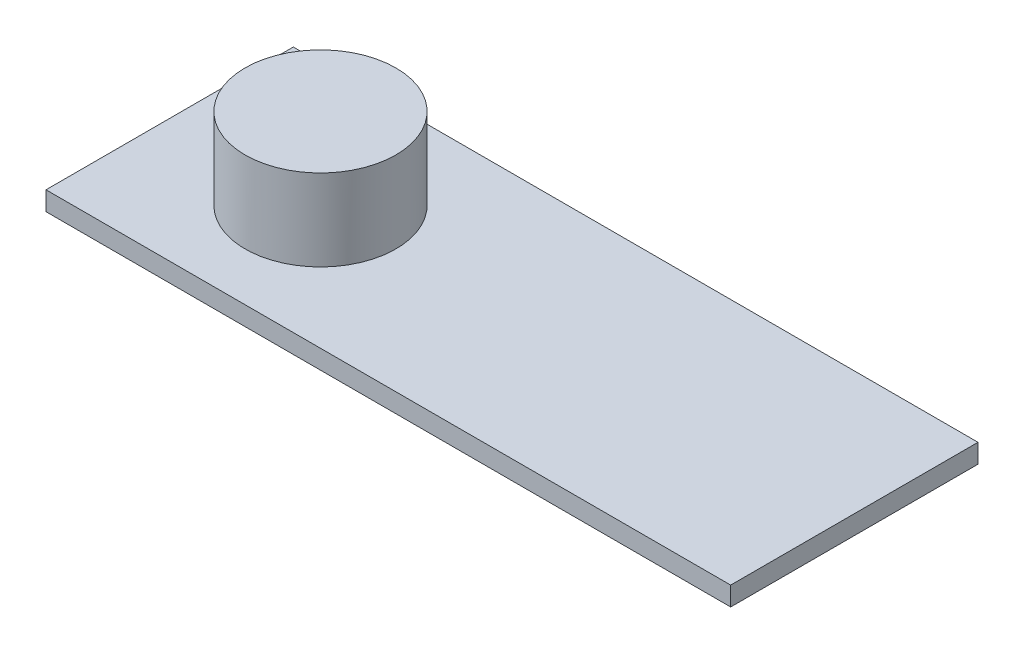
ISO-10303-21;
HEADER;
FILE_DESCRIPTION(('STEP AP214'),'2;1');
FILE_NAME('part.step','',(''),(''),'','','');
FILE_SCHEMA(('AUTOMOTIVE_DESIGN { 1 0 10303 214 1 1 1 1 }'));
ENDSEC;
DATA;
#1=APPLICATION_CONTEXT('core data for automotive mechanical design processes');
#2=APPLICATION_PROTOCOL_DEFINITION('international standard','automotive_design',2000,#1);
#3=PRODUCT_CONTEXT('',#1,'mechanical');
#4=PRODUCT('Part','Part','',(#3));
#5=PRODUCT_RELATED_PRODUCT_CATEGORY('part','',(#4));
#6=PRODUCT_DEFINITION_FORMATION('','',#4);
#7=PRODUCT_DEFINITION_CONTEXT('part definition',#1,'design');
#8=PRODUCT_DEFINITION('design','',#6,#7);
#9=PRODUCT_DEFINITION_SHAPE('','',#8);
#10=(LENGTH_UNIT() NAMED_UNIT(*) SI_UNIT(.MILLI.,.METRE.));
#11=(NAMED_UNIT(*) PLANE_ANGLE_UNIT() SI_UNIT($,.RADIAN.));
#12=(NAMED_UNIT(*) SI_UNIT($,.STERADIAN.) SOLID_ANGLE_UNIT());
#13=UNCERTAINTY_MEASURE_WITH_UNIT(LENGTH_MEASURE(1.E-05),#10,'distance_accuracy_value','');
#14=(GEOMETRIC_REPRESENTATION_CONTEXT(3) GLOBAL_UNCERTAINTY_ASSIGNED_CONTEXT((#13)) GLOBAL_UNIT_ASSIGNED_CONTEXT((#10,
#11,#12)) REPRESENTATION_CONTEXT('',''));
#15=CARTESIAN_POINT('',(0.,0.,0.));
#16=DIRECTION('',(0.,0.,1.));
#17=DIRECTION('',(1.,0.,0.));
#18=AXIS2_PLACEMENT_3D('',#15,#16,#17);
#19=CARTESIAN_POINT('',(28.829,1.6,10.414));
#20=DIRECTION('',(-1.,0.,0.));
#21=DIRECTION('',(0.,0.,1.));
#22=AXIS2_PLACEMENT_3D('',#19,#20,#21);
#23=PLANE('',#22);
#24=DIRECTION('',(0.,0.,-1.));
#25=VECTOR('',#24,1.);
#26=CARTESIAN_POINT('',(28.829,0.,10.414));
#27=LINE('',#26,#25);
#28=CARTESIAN_POINT('',(28.829,0.,10.414));
#29=VERTEX_POINT('',#28);
#30=CARTESIAN_POINT('',(28.829,0.,-10.414));
#31=VERTEX_POINT('',#30);
#32=EDGE_CURVE('E112',#29,#31,#27,.T.);
#33=ORIENTED_EDGE('',*,*,#32,.T.);
#34=DIRECTION('',(0.,-1.,0.));
#35=VECTOR('',#34,1.);
#36=CARTESIAN_POINT('',(28.829,1.6,-10.414));
#37=LINE('',#36,#35);
#38=CARTESIAN_POINT('',(28.829,1.6,-10.414));
#39=VERTEX_POINT('',#38);
#40=EDGE_CURVE('E50',#39,#31,#37,.T.);
#41=ORIENTED_EDGE('',*,*,#40,.F.);
#42=DIRECTION('',(0.,0.,-1.));
#43=VECTOR('',#42,1.);
#44=CARTESIAN_POINT('',(28.829,1.6,10.414));
#45=LINE('',#44,#43);
#46=CARTESIAN_POINT('',(28.829,1.6,10.414));
#47=VERTEX_POINT('',#46);
#48=EDGE_CURVE('E94',#47,#39,#45,.T.);
#49=ORIENTED_EDGE('',*,*,#48,.F.);
#50=DIRECTION('',(0.,-1.,0.));
#51=VECTOR('',#50,1.);
#52=CARTESIAN_POINT('',(28.829,1.6,10.414));
#53=LINE('',#52,#51);
#54=EDGE_CURVE('E108',#47,#29,#53,.T.);
#55=ORIENTED_EDGE('',*,*,#54,.T.);
#56=EDGE_LOOP('',(#33,#41,#49,#55));
#57=FACE_BOUND('',#56,.T.);
#58=ADVANCED_FACE('F41',(#57),#23,.F.);
#59=CARTESIAN_POINT('',(-28.829,1.6,-10.414));
#60=DIRECTION('',(0.,0.,1.));
#61=DIRECTION('',(1.,0.,0.));
#62=AXIS2_PLACEMENT_3D('',#59,#60,#61);
#63=PLANE('',#62);
#64=DIRECTION('',(-1.,0.,0.));
#65=VECTOR('',#64,1.);
#66=CARTESIAN_POINT('',(-28.829,0.,-10.414));
#67=LINE('',#66,#65);
#68=CARTESIAN_POINT('',(-28.829,0.,-10.414));
#69=VERTEX_POINT('',#68);
#70=EDGE_CURVE('E100',#31,#69,#67,.T.);
#71=ORIENTED_EDGE('',*,*,#70,.T.);
#72=DIRECTION('',(0.,-1.,0.));
#73=VECTOR('',#72,1.);
#74=CARTESIAN_POINT('',(-28.829,1.6,-10.414));
#75=LINE('',#74,#73);
#76=CARTESIAN_POINT('',(-28.829,1.6,-10.414));
#77=VERTEX_POINT('',#76);
#78=EDGE_CURVE('E98',#77,#69,#75,.T.);
#79=ORIENTED_EDGE('',*,*,#78,.F.);
#80=DIRECTION('',(-1.,0.,0.));
#81=VECTOR('',#80,1.);
#82=CARTESIAN_POINT('',(-28.829,1.6,-10.414));
#83=LINE('',#82,#81);
#84=EDGE_CURVE('E89',#39,#77,#83,.T.);
#85=ORIENTED_EDGE('',*,*,#84,.F.);
#86=ORIENTED_EDGE('',*,*,#40,.T.);
#87=EDGE_LOOP('',(#71,#79,#85,#86));
#88=FACE_BOUND('',#87,.T.);
#89=ADVANCED_FACE('F99',(#88),#63,.F.);
#90=CARTESIAN_POINT('',(-28.829,1.6,10.414));
#91=DIRECTION('',(1.,0.,0.));
#92=DIRECTION('',(0.,0.,-1.));
#93=AXIS2_PLACEMENT_3D('',#90,#91,#92);
#94=PLANE('',#93);
#95=DIRECTION('',(0.,0.,1.));
#96=VECTOR('',#95,1.);
#97=CARTESIAN_POINT('',(-28.829,0.,10.414));
#98=LINE('',#97,#96);
#99=CARTESIAN_POINT('',(-28.829,0.,10.414));
#100=VERTEX_POINT('',#99);
#101=EDGE_CURVE('E75',#69,#100,#98,.T.);
#102=ORIENTED_EDGE('',*,*,#101,.T.);
#103=DIRECTION('',(0.,-1.,0.));
#104=VECTOR('',#103,1.);
#105=CARTESIAN_POINT('',(-28.829,1.6,10.414));
#106=LINE('',#105,#104);
#107=CARTESIAN_POINT('',(-28.829,1.6,10.414));
#108=VERTEX_POINT('',#107);
#109=EDGE_CURVE('E102',#108,#100,#106,.T.);
#110=ORIENTED_EDGE('',*,*,#109,.F.);
#111=DIRECTION('',(0.,0.,1.));
#112=VECTOR('',#111,1.);
#113=CARTESIAN_POINT('',(-28.829,1.6,10.414));
#114=LINE('',#113,#112);
#115=EDGE_CURVE('E92',#77,#108,#114,.T.);
#116=ORIENTED_EDGE('',*,*,#115,.F.);
#117=ORIENTED_EDGE('',*,*,#78,.T.);
#118=EDGE_LOOP('',(#102,#110,#116,#117));
#119=FACE_BOUND('',#118,.T.);
#120=ADVANCED_FACE('F104',(#119),#94,.F.);
#121=CARTESIAN_POINT('',(-28.829,1.6,10.414));
#122=DIRECTION('',(0.,0.,-1.));
#123=DIRECTION('',(-1.,0.,0.));
#124=AXIS2_PLACEMENT_3D('',#121,#122,#123);
#125=PLANE('',#124);
#126=DIRECTION('',(1.,0.,0.));
#127=VECTOR('',#126,1.);
#128=CARTESIAN_POINT('',(-28.829,0.,10.414));
#129=LINE('',#128,#127);
#130=EDGE_CURVE('E81',#100,#29,#129,.T.);
#131=ORIENTED_EDGE('',*,*,#130,.T.);
#132=ORIENTED_EDGE('',*,*,#54,.F.);
#133=DIRECTION('',(1.,0.,0.));
#134=VECTOR('',#133,1.);
#135=CARTESIAN_POINT('',(-28.829,1.6,10.414));
#136=LINE('',#135,#134);
#137=EDGE_CURVE('E58',#108,#47,#136,.T.);
#138=ORIENTED_EDGE('',*,*,#137,.F.);
#139=ORIENTED_EDGE('',*,*,#109,.T.);
#140=EDGE_LOOP('',(#131,#132,#138,#139));
#141=FACE_BOUND('',#140,.T.);
#142=ADVANCED_FACE('F141',(#141),#125,.F.);
#143=CARTESIAN_POINT('',(0.,1.6,0.));
#144=DIRECTION('',(0.,-1.,0.));
#145=DIRECTION('',(0.,0.,-1.));
#146=AXIS2_PLACEMENT_3D('',#143,#144,#145);
#147=PLANE('',#146);
#148=CARTESIAN_POINT('',(-16.129,1.6,0.));
#149=DIRECTION('',(0.,-1.,0.));
#150=DIRECTION('',(0.,0.,-1.));
#151=AXIS2_PLACEMENT_3D('',#148,#149,#150);
#152=CIRCLE('',#151,6.35);
#153=CARTESIAN_POINT('',(-16.129,1.6,-6.35));
#154=VERTEX_POINT('',#153);
#155=EDGE_CURVE('E11',#154,#154,#152,.F.);
#156=ORIENTED_EDGE('',*,*,#155,.F.);
#157=EDGE_LOOP('',(#156));
#158=FACE_BOUND('',#157,.T.);
#159=ORIENTED_EDGE('',*,*,#48,.T.);
#160=ORIENTED_EDGE('',*,*,#84,.T.);
#161=ORIENTED_EDGE('',*,*,#115,.T.);
#162=ORIENTED_EDGE('',*,*,#137,.T.);
#163=EDGE_LOOP('',(#159,#160,#161,#162));
#164=FACE_BOUND('',#163,.T.);
#165=ADVANCED_FACE('F90',(#158,#164),#147,.F.);
#166=CARTESIAN_POINT('',(0.,0.,0.));
#167=DIRECTION('',(0.,-1.,0.));
#168=DIRECTION('',(0.,0.,-1.));
#169=AXIS2_PLACEMENT_3D('',#166,#167,#168);
#170=PLANE('',#169);
#171=ORIENTED_EDGE('',*,*,#32,.F.);
#172=ORIENTED_EDGE('',*,*,#130,.F.);
#173=ORIENTED_EDGE('',*,*,#101,.F.);
#174=ORIENTED_EDGE('',*,*,#70,.F.);
#175=EDGE_LOOP('',(#171,#172,#173,#174));
#176=FACE_BOUND('',#175,.T.);
#177=ADVANCED_FACE('F130',(#176),#170,.T.);
#178=CARTESIAN_POINT('',(-16.129,8.458,0.));
#179=DIRECTION('',(0.,-1.,0.));
#180=DIRECTION('',(0.,0.,-1.));
#181=AXIS2_PLACEMENT_3D('',#178,#179,#180);
#182=CYLINDRICAL_SURFACE('',#181,6.35);
#183=CARTESIAN_POINT('',(-16.129,8.458,0.));
#184=DIRECTION('',(0.,1.,0.));
#185=DIRECTION('',(0.,0.,1.));
#186=AXIS2_PLACEMENT_3D('',#183,#184,#185);
#187=CIRCLE('',#186,6.35);
#188=CARTESIAN_POINT('',(-16.129,8.458,6.35));
#189=VERTEX_POINT('',#188);
#190=EDGE_CURVE('E116',#189,#189,#187,.T.);
#191=ORIENTED_EDGE('',*,*,#190,.F.);
#192=EDGE_LOOP('',(#191));
#193=FACE_BOUND('',#192,.T.);
#194=ORIENTED_EDGE('',*,*,#155,.T.);
#195=EDGE_LOOP('',(#194));
#196=FACE_BOUND('',#195,.T.);
#197=ADVANCED_FACE('F132',(#193,#196),#182,.T.);
#198=CARTESIAN_POINT('',(-16.129,8.458,0.));
#199=DIRECTION('',(0.,1.,0.));
#200=DIRECTION('',(0.,0.,1.));
#201=AXIS2_PLACEMENT_3D('',#198,#199,#200);
#202=PLANE('',#201);
#203=ORIENTED_EDGE('',*,*,#190,.T.);
#204=EDGE_LOOP('',(#203));
#205=FACE_BOUND('',#204,.T.);
#206=ADVANCED_FACE('F138',(#205),#202,.T.);
#207=CLOSED_SHELL('',(#58,#89,#120,#142,#165,#177,#197,#206));
#208=MANIFOLD_SOLID_BREP('B2',#207);
#209=ADVANCED_BREP_SHAPE_REPRESENTATION('',(#18,#208),#14);
#210=SHAPE_DEFINITION_REPRESENTATION(#9,#209);
ENDSEC;
END-ISO-10303-21;
